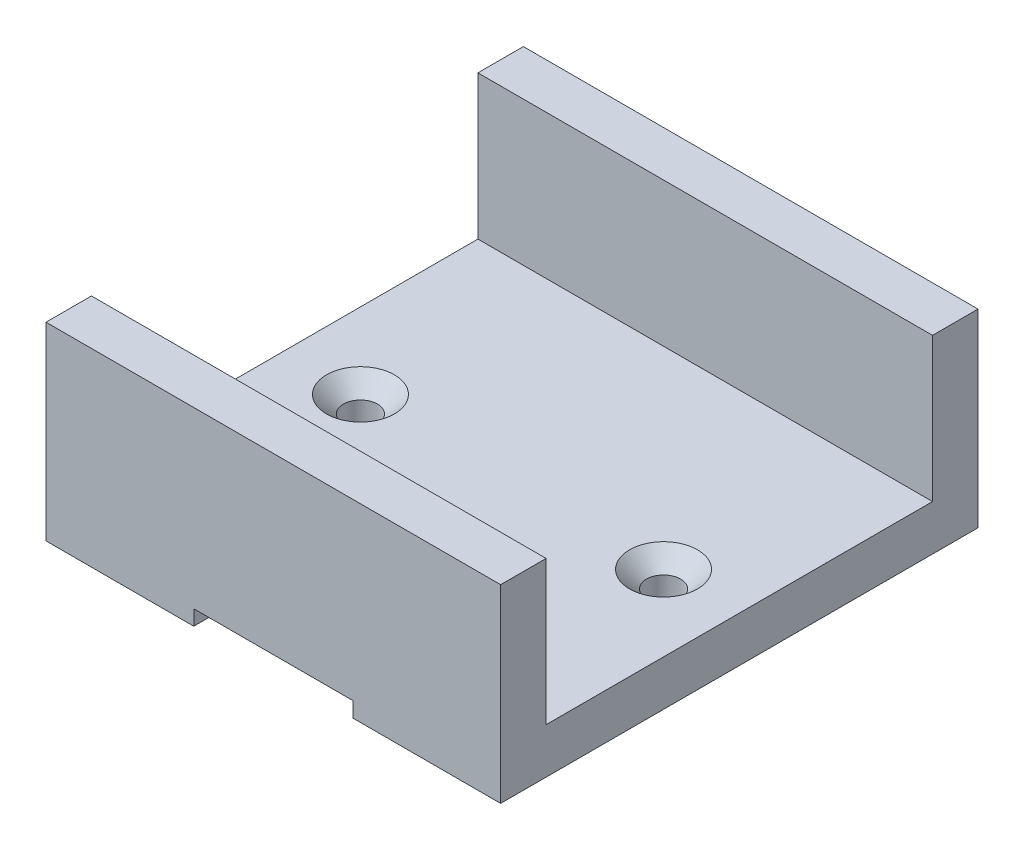
ISO-10303-21;
HEADER;
FILE_DESCRIPTION(('STEP AP214'),'2;1');
FILE_NAME('part.step','',(''),(''),'','','');
FILE_SCHEMA(('AUTOMOTIVE_DESIGN { 1 0 10303 214 1 1 1 1 }'));
ENDSEC;
DATA;
#1=APPLICATION_CONTEXT('core data for automotive mechanical design processes');
#2=APPLICATION_PROTOCOL_DEFINITION('international standard','automotive_design',2000,#1);
#3=PRODUCT_CONTEXT('',#1,'mechanical');
#4=PRODUCT('Part','Part','',(#3));
#5=PRODUCT_RELATED_PRODUCT_CATEGORY('part','',(#4));
#6=PRODUCT_DEFINITION_FORMATION('','',#4);
#7=PRODUCT_DEFINITION_CONTEXT('part definition',#1,'design');
#8=PRODUCT_DEFINITION('design','',#6,#7);
#9=PRODUCT_DEFINITION_SHAPE('','',#8);
#10=(LENGTH_UNIT() NAMED_UNIT(*) SI_UNIT(.MILLI.,.METRE.));
#11=(NAMED_UNIT(*) PLANE_ANGLE_UNIT() SI_UNIT($,.RADIAN.));
#12=(NAMED_UNIT(*) SI_UNIT($,.STERADIAN.) SOLID_ANGLE_UNIT());
#13=UNCERTAINTY_MEASURE_WITH_UNIT(LENGTH_MEASURE(1.E-05),#10,'distance_accuracy_value','');
#14=(GEOMETRIC_REPRESENTATION_CONTEXT(3) GLOBAL_UNCERTAINTY_ASSIGNED_CONTEXT((#13)) GLOBAL_UNIT_ASSIGNED_CONTEXT((#10,
#11,#12)) REPRESENTATION_CONTEXT('',''));
#15=CARTESIAN_POINT('',(0.,0.,0.));
#16=DIRECTION('',(0.,0.,1.));
#17=DIRECTION('',(1.,0.,0.));
#18=AXIS2_PLACEMENT_3D('',#15,#16,#17);
#19=CARTESIAN_POINT('',(60.,-12.5,0.));
#20=DIRECTION('',(0.,1.,0.));
#21=DIRECTION('',(0.,0.,1.));
#22=AXIS2_PLACEMENT_3D('',#19,#20,#21);
#23=PLANE('',#22);
#24=CARTESIAN_POINT('',(50.,-12.5,0.));
#25=DIRECTION('',(0.,1.,0.));
#26=DIRECTION('',(0.,0.,1.));
#27=AXIS2_PLACEMENT_3D('',#24,#25,#26);
#28=CIRCLE('',#27,2.25);
#29=CARTESIAN_POINT('',(50.,-12.5,2.25));
#30=VERTEX_POINT('',#29);
#31=EDGE_CURVE('E288',#30,#30,#28,.T.);
#32=ORIENTED_EDGE('',*,*,#31,.T.);
#33=EDGE_LOOP('',(#32));
#34=FACE_BOUND('',#33,.T.);
#35=DIRECTION('',(-1.,0.,0.));
#36=VECTOR('',#35,1.);
#37=CARTESIAN_POINT('',(60.,-12.5,31.5));
#38=LINE('',#37,#36);
#39=CARTESIAN_POINT('',(60.,-12.5,31.5));
#40=VERTEX_POINT('',#39);
#41=CARTESIAN_POINT('',(40.5,-12.5,31.5));
#42=VERTEX_POINT('',#41);
#43=EDGE_CURVE('E187',#40,#42,#38,.T.);
#44=ORIENTED_EDGE('',*,*,#43,.T.);
#45=DIRECTION('',(0.,0.,1.));
#46=VECTOR('',#45,1.);
#47=CARTESIAN_POINT('',(40.5,-12.5,-31.5));
#48=LINE('',#47,#46);
#49=CARTESIAN_POINT('',(40.5,-12.5,-31.5));
#50=VERTEX_POINT('',#49);
#51=EDGE_CURVE('E138',#50,#42,#48,.T.);
#52=ORIENTED_EDGE('',*,*,#51,.F.);
#53=DIRECTION('',(-1.,0.,0.));
#54=VECTOR('',#53,1.);
#55=CARTESIAN_POINT('',(60.,-12.5,-31.5));
#56=LINE('',#55,#54);
#57=CARTESIAN_POINT('',(60.,-12.5,-31.5));
#58=VERTEX_POINT('',#57);
#59=EDGE_CURVE('E136',#58,#50,#56,.T.);
#60=ORIENTED_EDGE('',*,*,#59,.F.);
#61=DIRECTION('',(0.,0.,-1.));
#62=VECTOR('',#61,1.);
#63=CARTESIAN_POINT('',(60.,-12.5,0.));
#64=LINE('',#63,#62);
#65=EDGE_CURVE('E120',#40,#58,#64,.T.);
#66=ORIENTED_EDGE('',*,*,#65,.F.);
#67=EDGE_LOOP('',(#44,#52,#60,#66));
#68=FACE_BOUND('',#67,.T.);
#69=ADVANCED_FACE('F41',(#34,#68),#23,.F.);
#70=CARTESIAN_POINT('',(60.,0.,-25.5));
#71=DIRECTION('',(0.,0.,1.));
#72=DIRECTION('',(1.,0.,0.));
#73=AXIS2_PLACEMENT_3D('',#70,#71,#72);
#74=PLANE('',#73);
#75=DIRECTION('',(0.,1.,0.));
#76=VECTOR('',#75,1.);
#77=CARTESIAN_POINT('',(0.,0.,-25.5));
#78=LINE('',#77,#76);
#79=CARTESIAN_POINT('',(0.,-6.5,-25.5));
#80=VERTEX_POINT('',#79);
#81=CARTESIAN_POINT('',(0.,12.5,-25.5));
#82=VERTEX_POINT('',#81);
#83=EDGE_CURVE('E156',#80,#82,#78,.T.);
#84=ORIENTED_EDGE('',*,*,#83,.F.);
#85=DIRECTION('',(-1.,0.,0.));
#86=VECTOR('',#85,1.);
#87=CARTESIAN_POINT('',(60.,-6.5,-25.5));
#88=LINE('',#87,#86);
#89=CARTESIAN_POINT('',(60.,-6.5,-25.5));
#90=VERTEX_POINT('',#89);
#91=EDGE_CURVE('E11',#90,#80,#88,.T.);
#92=ORIENTED_EDGE('',*,*,#91,.F.);
#93=DIRECTION('',(0.,1.,0.));
#94=VECTOR('',#93,1.);
#95=CARTESIAN_POINT('',(60.,0.,-25.5));
#96=LINE('',#95,#94);
#97=CARTESIAN_POINT('',(60.,12.5,-25.5));
#98=VERTEX_POINT('',#97);
#99=EDGE_CURVE('E215',#90,#98,#96,.T.);
#100=ORIENTED_EDGE('',*,*,#99,.T.);
#101=DIRECTION('',(-1.,0.,0.));
#102=VECTOR('',#101,1.);
#103=CARTESIAN_POINT('',(60.,12.5,-25.5));
#104=LINE('',#103,#102);
#105=EDGE_CURVE('E66',#98,#82,#104,.T.);
#106=ORIENTED_EDGE('',*,*,#105,.T.);
#107=EDGE_LOOP('',(#84,#92,#100,#106));
#108=FACE_BOUND('',#107,.T.);
#109=ADVANCED_FACE('F43',(#108),#74,.T.);
#110=CARTESIAN_POINT('',(60.,-6.5,0.));
#111=DIRECTION('',(0.,1.,0.));
#112=DIRECTION('',(0.,0.,1.));
#113=AXIS2_PLACEMENT_3D('',#110,#111,#112);
#114=PLANE('',#113);
#115=CARTESIAN_POINT('',(10.,-6.5,0.));
#116=DIRECTION('',(0.,1.,0.));
#117=DIRECTION('',(0.,0.,1.));
#118=AXIS2_PLACEMENT_3D('',#115,#116,#117);
#119=CIRCLE('',#118,4.48);
#120=CARTESIAN_POINT('',(10.,-6.5,4.48));
#121=VERTEX_POINT('',#120);
#122=EDGE_CURVE('E311',#121,#121,#119,.T.);
#123=ORIENTED_EDGE('',*,*,#122,.F.);
#124=EDGE_LOOP('',(#123));
#125=FACE_BOUND('',#124,.T.);
#126=CARTESIAN_POINT('',(50.,-6.5,0.));
#127=DIRECTION('',(0.,1.,0.));
#128=DIRECTION('',(0.,0.,1.));
#129=AXIS2_PLACEMENT_3D('',#126,#127,#128);
#130=CIRCLE('',#129,4.48);
#131=CARTESIAN_POINT('',(50.,-6.5,4.48));
#132=VERTEX_POINT('',#131);
#133=EDGE_CURVE('E299',#132,#132,#130,.T.);
#134=ORIENTED_EDGE('',*,*,#133,.F.);
#135=EDGE_LOOP('',(#134));
#136=FACE_BOUND('',#135,.T.);
#137=DIRECTION('',(0.,0.,-1.));
#138=VECTOR('',#137,1.);
#139=CARTESIAN_POINT('',(0.,-6.5,0.));
#140=LINE('',#139,#138);
#141=CARTESIAN_POINT('',(0.,-6.5,25.5));
#142=VERTEX_POINT('',#141);
#143=EDGE_CURVE('E159',#142,#80,#140,.T.);
#144=ORIENTED_EDGE('',*,*,#143,.F.);
#145=DIRECTION('',(-1.,0.,0.));
#146=VECTOR('',#145,1.);
#147=CARTESIAN_POINT('',(60.,-6.5,25.5));
#148=LINE('',#147,#146);
#149=CARTESIAN_POINT('',(60.,-6.5,25.5));
#150=VERTEX_POINT('',#149);
#151=EDGE_CURVE('E50',#150,#142,#148,.T.);
#152=ORIENTED_EDGE('',*,*,#151,.F.);
#153=DIRECTION('',(0.,0.,-1.));
#154=VECTOR('',#153,1.);
#155=CARTESIAN_POINT('',(60.,-6.5,0.));
#156=LINE('',#155,#154);
#157=EDGE_CURVE('E210',#150,#90,#156,.T.);
#158=ORIENTED_EDGE('',*,*,#157,.T.);
#159=ORIENTED_EDGE('',*,*,#91,.T.);
#160=EDGE_LOOP('',(#144,#152,#158,#159));
#161=FACE_BOUND('',#160,.T.);
#162=ADVANCED_FACE('F209',(#125,#136,#161),#114,.T.);
#163=CARTESIAN_POINT('',(60.,0.,25.5));
#164=DIRECTION('',(0.,0.,1.));
#165=DIRECTION('',(1.,0.,0.));
#166=AXIS2_PLACEMENT_3D('',#163,#164,#165);
#167=PLANE('',#166);
#168=DIRECTION('',(0.,1.,0.));
#169=VECTOR('',#168,1.);
#170=CARTESIAN_POINT('',(0.,0.,25.5));
#171=LINE('',#170,#169);
#172=CARTESIAN_POINT('',(0.,12.5,25.5));
#173=VERTEX_POINT('',#172);
#174=EDGE_CURVE('E163',#142,#173,#171,.T.);
#175=ORIENTED_EDGE('',*,*,#174,.T.);
#176=DIRECTION('',(-1.,0.,0.));
#177=VECTOR('',#176,1.);
#178=CARTESIAN_POINT('',(60.,12.5,25.5));
#179=LINE('',#178,#177);
#180=CARTESIAN_POINT('',(60.,12.5,25.5));
#181=VERTEX_POINT('',#180);
#182=EDGE_CURVE('E193',#181,#173,#179,.T.);
#183=ORIENTED_EDGE('',*,*,#182,.F.);
#184=DIRECTION('',(0.,1.,0.));
#185=VECTOR('',#184,1.);
#186=CARTESIAN_POINT('',(60.,0.,25.5));
#187=LINE('',#186,#185);
#188=EDGE_CURVE('E201',#150,#181,#187,.T.);
#189=ORIENTED_EDGE('',*,*,#188,.F.);
#190=ORIENTED_EDGE('',*,*,#151,.T.);
#191=EDGE_LOOP('',(#175,#183,#189,#190));
#192=FACE_BOUND('',#191,.T.);
#193=ADVANCED_FACE('F199',(#192),#167,.F.);
#194=CARTESIAN_POINT('',(60.,12.5,0.));
#195=DIRECTION('',(0.,1.,0.));
#196=DIRECTION('',(0.,0.,1.));
#197=AXIS2_PLACEMENT_3D('',#194,#195,#196);
#198=PLANE('',#197);
#199=DIRECTION('',(0.,0.,-1.));
#200=VECTOR('',#199,1.);
#201=CARTESIAN_POINT('',(0.,12.5,0.));
#202=LINE('',#201,#200);
#203=CARTESIAN_POINT('',(0.,12.5,31.5));
#204=VERTEX_POINT('',#203);
#205=EDGE_CURVE('E167',#204,#173,#202,.T.);
#206=ORIENTED_EDGE('',*,*,#205,.F.);
#207=DIRECTION('',(-1.,0.,0.));
#208=VECTOR('',#207,1.);
#209=CARTESIAN_POINT('',(60.,12.5,31.5));
#210=LINE('',#209,#208);
#211=CARTESIAN_POINT('',(60.,12.5,31.5));
#212=VERTEX_POINT('',#211);
#213=EDGE_CURVE('E190',#212,#204,#210,.T.);
#214=ORIENTED_EDGE('',*,*,#213,.F.);
#215=DIRECTION('',(0.,0.,-1.));
#216=VECTOR('',#215,1.);
#217=CARTESIAN_POINT('',(60.,12.5,0.));
#218=LINE('',#217,#216);
#219=EDGE_CURVE('E153',#212,#181,#218,.T.);
#220=ORIENTED_EDGE('',*,*,#219,.T.);
#221=ORIENTED_EDGE('',*,*,#182,.T.);
#222=EDGE_LOOP('',(#206,#214,#220,#221));
#223=FACE_BOUND('',#222,.T.);
#224=ADVANCED_FACE('F351',(#223),#198,.T.);
#225=CARTESIAN_POINT('',(60.,0.,31.5));
#226=DIRECTION('',(0.,0.,1.));
#227=DIRECTION('',(1.,0.,0.));
#228=AXIS2_PLACEMENT_3D('',#225,#226,#227);
#229=PLANE('',#228);
#230=DIRECTION('',(0.,1.,0.));
#231=VECTOR('',#230,1.);
#232=CARTESIAN_POINT('',(40.5,-10.5,31.5));
#233=LINE('',#232,#231);
#234=CARTESIAN_POINT('',(40.5,-10.5,31.5));
#235=VERTEX_POINT('',#234);
#236=EDGE_CURVE('E234',#42,#235,#233,.T.);
#237=ORIENTED_EDGE('',*,*,#236,.F.);
#238=ORIENTED_EDGE('',*,*,#43,.F.);
#239=DIRECTION('',(0.,1.,0.));
#240=VECTOR('',#239,1.);
#241=CARTESIAN_POINT('',(60.,0.,31.5));
#242=LINE('',#241,#240);
#243=EDGE_CURVE('E129',#40,#212,#242,.T.);
#244=ORIENTED_EDGE('',*,*,#243,.T.);
#245=ORIENTED_EDGE('',*,*,#213,.T.);
#246=DIRECTION('',(0.,1.,0.));
#247=VECTOR('',#246,1.);
#248=CARTESIAN_POINT('',(0.,0.,31.5));
#249=LINE('',#248,#247);
#250=CARTESIAN_POINT('',(0.,-12.5,31.5));
#251=VERTEX_POINT('',#250);
#252=EDGE_CURVE('E171',#251,#204,#249,.T.);
#253=ORIENTED_EDGE('',*,*,#252,.F.);
#254=CARTESIAN_POINT('',(19.5,-12.5,31.5));
#255=VERTEX_POINT('',#254);
#256=EDGE_CURVE('E142',#255,#251,#38,.T.);
#257=ORIENTED_EDGE('',*,*,#256,.F.);
#258=DIRECTION('',(0.,-1.,0.));
#259=VECTOR('',#258,1.);
#260=CARTESIAN_POINT('',(19.5,-10.5,31.5));
#261=LINE('',#260,#259);
#262=CARTESIAN_POINT('',(19.5,-10.5,31.5));
#263=VERTEX_POINT('',#262);
#264=EDGE_CURVE('E245',#263,#255,#261,.T.);
#265=ORIENTED_EDGE('',*,*,#264,.F.);
#266=DIRECTION('',(-1.,0.,0.));
#267=VECTOR('',#266,1.);
#268=CARTESIAN_POINT('',(19.5,-10.5,31.5));
#269=LINE('',#268,#267);
#270=EDGE_CURVE('E271',#235,#263,#269,.T.);
#271=ORIENTED_EDGE('',*,*,#270,.F.);
#272=EDGE_LOOP('',(#237,#238,#244,#245,#253,#257,#265,#271));
#273=FACE_BOUND('',#272,.T.);
#274=ADVANCED_FACE('F230',(#273),#229,.T.);
#275=CARTESIAN_POINT('',(10.,-12.5,0.));
#276=DIRECTION('',(0.,1.,0.));
#277=DIRECTION('',(0.,0.,1.));
#278=AXIS2_PLACEMENT_3D('',#275,#276,#277);
#279=CIRCLE('',#278,2.25);
#280=CARTESIAN_POINT('',(10.,-12.5,2.25));
#281=VERTEX_POINT('',#280);
#282=EDGE_CURVE('E303',#281,#281,#279,.T.);
#283=ORIENTED_EDGE('',*,*,#282,.T.);
#284=EDGE_LOOP('',(#283));
#285=FACE_BOUND('',#284,.T.);
#286=CARTESIAN_POINT('',(19.5,-12.5,-31.5));
#287=VERTEX_POINT('',#286);
#288=CARTESIAN_POINT('',(0.,-12.5,-31.5));
#289=VERTEX_POINT('',#288);
#290=EDGE_CURVE('E143',#287,#289,#56,.T.);
#291=ORIENTED_EDGE('',*,*,#290,.F.);
#292=DIRECTION('',(0.,0.,1.));
#293=VECTOR('',#292,1.);
#294=CARTESIAN_POINT('',(19.5,-12.5,-31.5));
#295=LINE('',#294,#293);
#296=EDGE_CURVE('E253',#287,#255,#295,.T.);
#297=ORIENTED_EDGE('',*,*,#296,.T.);
#298=ORIENTED_EDGE('',*,*,#256,.T.);
#299=DIRECTION('',(0.,0.,-1.));
#300=VECTOR('',#299,1.);
#301=CARTESIAN_POINT('',(0.,-12.5,0.));
#302=LINE('',#301,#300);
#303=EDGE_CURVE('E176',#251,#289,#302,.T.);
#304=ORIENTED_EDGE('',*,*,#303,.T.);
#305=EDGE_LOOP('',(#291,#297,#298,#304));
#306=FACE_BOUND('',#305,.T.);
#307=ADVANCED_FACE('F266',(#285,#306),#23,.F.);
#308=CARTESIAN_POINT('',(60.,0.,-31.5));
#309=DIRECTION('',(0.,0.,1.));
#310=DIRECTION('',(1.,0.,0.));
#311=AXIS2_PLACEMENT_3D('',#308,#309,#310);
#312=PLANE('',#311);
#313=ORIENTED_EDGE('',*,*,#59,.T.);
#314=DIRECTION('',(0.,1.,0.));
#315=VECTOR('',#314,1.);
#316=CARTESIAN_POINT('',(40.5,-10.5,-31.5));
#317=LINE('',#316,#315);
#318=CARTESIAN_POINT('',(40.5,-10.5,-31.5));
#319=VERTEX_POINT('',#318);
#320=EDGE_CURVE('E273',#50,#319,#317,.T.);
#321=ORIENTED_EDGE('',*,*,#320,.T.);
#322=DIRECTION('',(-1.,0.,0.));
#323=VECTOR('',#322,1.);
#324=CARTESIAN_POINT('',(19.5,-10.5,-31.5));
#325=LINE('',#324,#323);
#326=CARTESIAN_POINT('',(19.5,-10.5,-31.5));
#327=VERTEX_POINT('',#326);
#328=EDGE_CURVE('E263',#319,#327,#325,.T.);
#329=ORIENTED_EDGE('',*,*,#328,.T.);
#330=DIRECTION('',(0.,-1.,0.));
#331=VECTOR('',#330,1.);
#332=CARTESIAN_POINT('',(19.5,-10.5,-31.5));
#333=LINE('',#332,#331);
#334=EDGE_CURVE('E57',#327,#287,#333,.T.);
#335=ORIENTED_EDGE('',*,*,#334,.T.);
#336=ORIENTED_EDGE('',*,*,#290,.T.);
#337=DIRECTION('',(0.,1.,0.));
#338=VECTOR('',#337,1.);
#339=CARTESIAN_POINT('',(0.,0.,-31.5));
#340=LINE('',#339,#338);
#341=CARTESIAN_POINT('',(0.,12.5,-31.5));
#342=VERTEX_POINT('',#341);
#343=EDGE_CURVE('E180',#289,#342,#340,.T.);
#344=ORIENTED_EDGE('',*,*,#343,.T.);
#345=DIRECTION('',(-1.,0.,0.));
#346=VECTOR('',#345,1.);
#347=CARTESIAN_POINT('',(60.,12.5,-31.5));
#348=LINE('',#347,#346);
#349=CARTESIAN_POINT('',(60.,12.5,-31.5));
#350=VERTEX_POINT('',#349);
#351=EDGE_CURVE('E147',#350,#342,#348,.T.);
#352=ORIENTED_EDGE('',*,*,#351,.F.);
#353=DIRECTION('',(0.,1.,0.));
#354=VECTOR('',#353,1.);
#355=CARTESIAN_POINT('',(60.,0.,-31.5));
#356=LINE('',#355,#354);
#357=EDGE_CURVE('E125',#58,#350,#356,.T.);
#358=ORIENTED_EDGE('',*,*,#357,.F.);
#359=EDGE_LOOP('',(#313,#321,#329,#335,#336,#344,#352,#358));
#360=FACE_BOUND('',#359,.T.);
#361=ADVANCED_FACE('F145',(#360),#312,.F.);
#362=EDGE_CURVE('E172',#82,#342,#202,.T.);
#363=ORIENTED_EDGE('',*,*,#362,.F.);
#364=ORIENTED_EDGE('',*,*,#105,.F.);
#365=EDGE_CURVE('E149',#98,#350,#218,.T.);
#366=ORIENTED_EDGE('',*,*,#365,.T.);
#367=ORIENTED_EDGE('',*,*,#351,.T.);
#368=EDGE_LOOP('',(#363,#364,#366,#367));
#369=FACE_BOUND('',#368,.T.);
#370=ADVANCED_FACE('F213',(#369),#198,.T.);
#371=CARTESIAN_POINT('',(60.,0.,0.));
#372=DIRECTION('',(1.,0.,0.));
#373=DIRECTION('',(0.,0.,-1.));
#374=AXIS2_PLACEMENT_3D('',#371,#372,#373);
#375=PLANE('',#374);
#376=ORIENTED_EDGE('',*,*,#99,.F.);
#377=ORIENTED_EDGE('',*,*,#157,.F.);
#378=ORIENTED_EDGE('',*,*,#188,.T.);
#379=ORIENTED_EDGE('',*,*,#219,.F.);
#380=ORIENTED_EDGE('',*,*,#243,.F.);
#381=ORIENTED_EDGE('',*,*,#65,.T.);
#382=ORIENTED_EDGE('',*,*,#357,.T.);
#383=ORIENTED_EDGE('',*,*,#365,.F.);
#384=EDGE_LOOP('',(#376,#377,#378,#379,#380,#381,#382,#383));
#385=FACE_BOUND('',#384,.T.);
#386=ADVANCED_FACE('F122',(#385),#375,.T.);
#387=CARTESIAN_POINT('',(0.,0.,0.));
#388=DIRECTION('',(1.,0.,0.));
#389=DIRECTION('',(0.,0.,-1.));
#390=AXIS2_PLACEMENT_3D('',#387,#388,#389);
#391=PLANE('',#390);
#392=ORIENTED_EDGE('',*,*,#83,.T.);
#393=ORIENTED_EDGE('',*,*,#362,.T.);
#394=ORIENTED_EDGE('',*,*,#343,.F.);
#395=ORIENTED_EDGE('',*,*,#303,.F.);
#396=ORIENTED_EDGE('',*,*,#252,.T.);
#397=ORIENTED_EDGE('',*,*,#205,.T.);
#398=ORIENTED_EDGE('',*,*,#174,.F.);
#399=ORIENTED_EDGE('',*,*,#143,.T.);
#400=EDGE_LOOP('',(#392,#393,#394,#395,#396,#397,#398,#399));
#401=FACE_BOUND('',#400,.T.);
#402=ADVANCED_FACE('F207',(#401),#391,.F.);
#403=CARTESIAN_POINT('',(40.5,-10.5,-31.5));
#404=DIRECTION('',(1.,0.,0.));
#405=DIRECTION('',(0.,0.,-1.));
#406=AXIS2_PLACEMENT_3D('',#403,#404,#405);
#407=PLANE('',#406);
#408=ORIENTED_EDGE('',*,*,#236,.T.);
#409=DIRECTION('',(0.,0.,1.));
#410=VECTOR('',#409,1.);
#411=CARTESIAN_POINT('',(40.5,-10.5,-31.5));
#412=LINE('',#411,#410);
#413=EDGE_CURVE('E221',#319,#235,#412,.T.);
#414=ORIENTED_EDGE('',*,*,#413,.F.);
#415=ORIENTED_EDGE('',*,*,#320,.F.);
#416=ORIENTED_EDGE('',*,*,#51,.T.);
#417=EDGE_LOOP('',(#408,#414,#415,#416));
#418=FACE_BOUND('',#417,.T.);
#419=ADVANCED_FACE('F286',(#418),#407,.F.);
#420=CARTESIAN_POINT('',(19.5,-10.5,-31.5));
#421=DIRECTION('',(-1.,0.,0.));
#422=DIRECTION('',(0.,0.,1.));
#423=AXIS2_PLACEMENT_3D('',#420,#421,#422);
#424=PLANE('',#423);
#425=ORIENTED_EDGE('',*,*,#264,.T.);
#426=ORIENTED_EDGE('',*,*,#296,.F.);
#427=ORIENTED_EDGE('',*,*,#334,.F.);
#428=DIRECTION('',(0.,0.,1.));
#429=VECTOR('',#428,1.);
#430=CARTESIAN_POINT('',(19.5,-10.5,-31.5));
#431=LINE('',#430,#429);
#432=EDGE_CURVE('E259',#327,#263,#431,.T.);
#433=ORIENTED_EDGE('',*,*,#432,.T.);
#434=EDGE_LOOP('',(#425,#426,#427,#433));
#435=FACE_BOUND('',#434,.T.);
#436=ADVANCED_FACE('F254',(#435),#424,.F.);
#437=CARTESIAN_POINT('',(19.5,-10.5,-31.5));
#438=DIRECTION('',(0.,1.,0.));
#439=DIRECTION('',(-1.,0.,0.));
#440=AXIS2_PLACEMENT_3D('',#437,#438,#439);
#441=PLANE('',#440);
#442=ORIENTED_EDGE('',*,*,#270,.T.);
#443=ORIENTED_EDGE('',*,*,#432,.F.);
#444=ORIENTED_EDGE('',*,*,#328,.F.);
#445=ORIENTED_EDGE('',*,*,#413,.T.);
#446=EDGE_LOOP('',(#442,#443,#444,#445));
#447=FACE_BOUND('',#446,.T.);
#448=ADVANCED_FACE('F285',(#447),#441,.F.);
#449=CARTESIAN_POINT('',(50.,-6.5,0.));
#450=DIRECTION('',(0.,1.,0.));
#451=DIRECTION('',(0.,0.,1.));
#452=AXIS2_PLACEMENT_3D('',#449,#450,#451);
#453=CYLINDRICAL_SURFACE('',#452,2.25);
#454=ORIENTED_EDGE('',*,*,#31,.F.);
#455=EDGE_LOOP('',(#454));
#456=FACE_BOUND('',#455,.T.);
#457=CARTESIAN_POINT('',(50.,-8.73,0.));
#458=DIRECTION('',(0.,1.,0.));
#459=DIRECTION('',(0.,0.,1.));
#460=AXIS2_PLACEMENT_3D('',#457,#458,#459);
#461=CIRCLE('',#460,2.25);
#462=CARTESIAN_POINT('',(50.,-8.73,2.25));
#463=VERTEX_POINT('',#462);
#464=EDGE_CURVE('E291',#463,#463,#461,.T.);
#465=ORIENTED_EDGE('',*,*,#464,.T.);
#466=EDGE_LOOP('',(#465));
#467=FACE_BOUND('',#466,.T.);
#468=ADVANCED_FACE('F325',(#456,#467),#453,.F.);
#469=CARTESIAN_POINT('',(50.,-6.5,0.));
#470=DIRECTION('',(0.,1.,0.));
#471=DIRECTION('',(0.,0.,1.));
#472=AXIS2_PLACEMENT_3D('',#469,#470,#471);
#473=CONICAL_SURFACE('',#472,4.48,0.785398163397447);
#474=ORIENTED_EDGE('',*,*,#464,.F.);
#475=EDGE_LOOP('',(#474));
#476=FACE_BOUND('',#475,.T.);
#477=ORIENTED_EDGE('',*,*,#133,.T.);
#478=EDGE_LOOP('',(#477));
#479=FACE_BOUND('',#478,.T.);
#480=ADVANCED_FACE('F322',(#476,#479),#473,.F.);
#481=CARTESIAN_POINT('',(10.,-6.5,0.));
#482=DIRECTION('',(0.,1.,0.));
#483=DIRECTION('',(0.,0.,1.));
#484=AXIS2_PLACEMENT_3D('',#481,#482,#483);
#485=CYLINDRICAL_SURFACE('',#484,2.25);
#486=ORIENTED_EDGE('',*,*,#282,.F.);
#487=EDGE_LOOP('',(#486));
#488=FACE_BOUND('',#487,.T.);
#489=CARTESIAN_POINT('',(10.,-8.73,0.));
#490=DIRECTION('',(0.,1.,0.));
#491=DIRECTION('',(0.,0.,1.));
#492=AXIS2_PLACEMENT_3D('',#489,#490,#491);
#493=CIRCLE('',#492,2.25);
#494=CARTESIAN_POINT('',(10.,-8.73,2.25));
#495=VERTEX_POINT('',#494);
#496=EDGE_CURVE('E307',#495,#495,#493,.T.);
#497=ORIENTED_EDGE('',*,*,#496,.T.);
#498=EDGE_LOOP('',(#497));
#499=FACE_BOUND('',#498,.T.);
#500=ADVANCED_FACE('F324',(#488,#499),#485,.F.);
#501=CARTESIAN_POINT('',(10.,-6.5,0.));
#502=DIRECTION('',(0.,1.,0.));
#503=DIRECTION('',(0.,0.,1.));
#504=AXIS2_PLACEMENT_3D('',#501,#502,#503);
#505=CONICAL_SURFACE('',#504,4.48,0.785398163397448);
#506=ORIENTED_EDGE('',*,*,#496,.F.);
#507=EDGE_LOOP('',(#506));
#508=FACE_BOUND('',#507,.T.);
#509=ORIENTED_EDGE('',*,*,#122,.T.);
#510=EDGE_LOOP('',(#509));
#511=FACE_BOUND('',#510,.T.);
#512=ADVANCED_FACE('F316',(#508,#511),#505,.F.);
#513=CLOSED_SHELL('',(#69,#109,#162,#193,#224,#274,#307,#361,#370,#386,#402,#419,#436,#448,#468,
#480,#500,#512));
#514=MANIFOLD_SOLID_BREP('B2',#513);
#515=ADVANCED_BREP_SHAPE_REPRESENTATION('',(#18,#514),#14);
#516=SHAPE_DEFINITION_REPRESENTATION(#9,#515);
ENDSEC;
END-ISO-10303-21;
